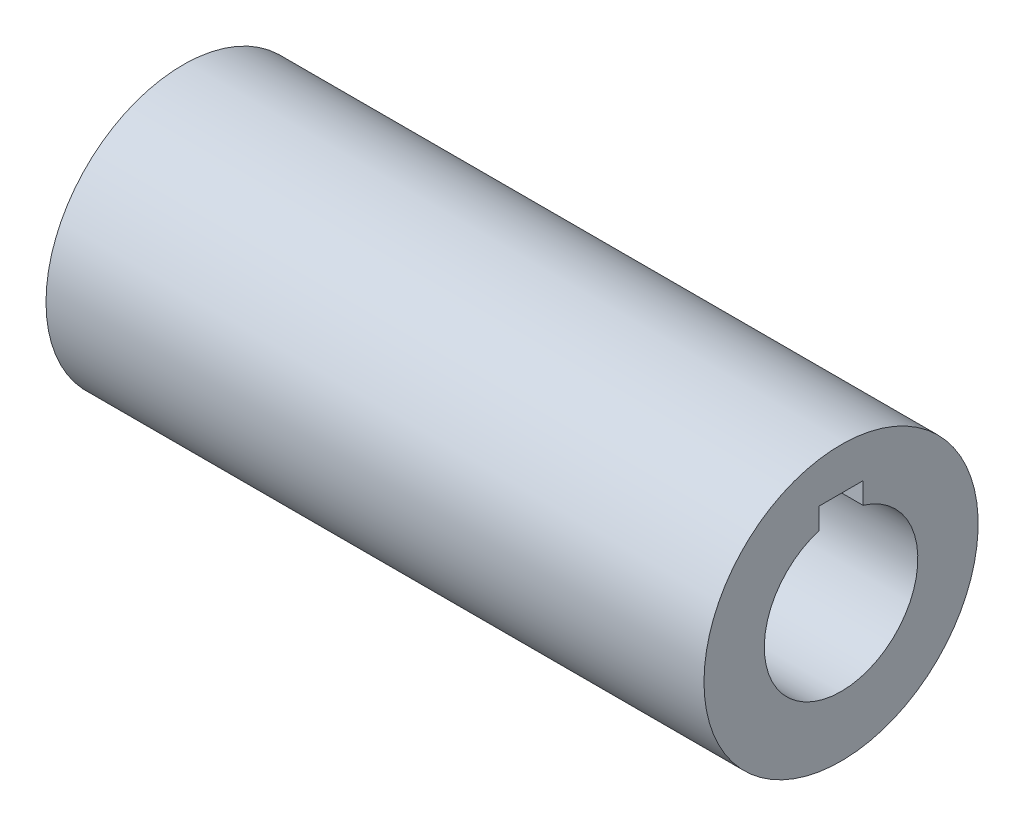
ISO-10303-21;
HEADER;
FILE_DESCRIPTION(('STEP AP214'),'2;1');
FILE_NAME('part.step','',(''),(''),'','','');
FILE_SCHEMA(('AUTOMOTIVE_DESIGN { 1 0 10303 214 1 1 1 1 }'));
ENDSEC;
DATA;
#1=APPLICATION_CONTEXT('core data for automotive mechanical design processes');
#2=APPLICATION_PROTOCOL_DEFINITION('international standard','automotive_design',2000,#1);
#3=PRODUCT_CONTEXT('',#1,'mechanical');
#4=PRODUCT('Part','Part','',(#3));
#5=PRODUCT_RELATED_PRODUCT_CATEGORY('part','',(#4));
#6=PRODUCT_DEFINITION_FORMATION('','',#4);
#7=PRODUCT_DEFINITION_CONTEXT('part definition',#1,'design');
#8=PRODUCT_DEFINITION('design','',#6,#7);
#9=PRODUCT_DEFINITION_SHAPE('','',#8);
#10=(LENGTH_UNIT() NAMED_UNIT(*) SI_UNIT(.MILLI.,.METRE.));
#11=(NAMED_UNIT(*) PLANE_ANGLE_UNIT() SI_UNIT($,.RADIAN.));
#12=(NAMED_UNIT(*) SI_UNIT($,.STERADIAN.) SOLID_ANGLE_UNIT());
#13=UNCERTAINTY_MEASURE_WITH_UNIT(LENGTH_MEASURE(1.E-05),#10,'distance_accuracy_value','');
#14=(GEOMETRIC_REPRESENTATION_CONTEXT(3) GLOBAL_UNCERTAINTY_ASSIGNED_CONTEXT((#13)) GLOBAL_UNIT_ASSIGNED_CONTEXT((#10,
#11,#12)) REPRESENTATION_CONTEXT('',''));
#15=CARTESIAN_POINT('',(0.,0.,0.));
#16=DIRECTION('',(0.,0.,1.));
#17=DIRECTION('',(1.,0.,0.));
#18=AXIS2_PLACEMENT_3D('',#15,#16,#17);
#19=CARTESIAN_POINT('',(59.9999999999996,0.,0.));
#20=DIRECTION('',(-1.,0.,0.));
#21=DIRECTION('',(0.,0.,1.));
#22=AXIS2_PLACEMENT_3D('',#19,#20,#21);
#23=CYLINDRICAL_SURFACE('',#22,21.);
#24=CARTESIAN_POINT('',(-5.87258300203075,0.,0.));
#25=DIRECTION('',(1.,0.,0.));
#26=DIRECTION('',(0.,0.,-1.));
#27=AXIS2_PLACEMENT_3D('',#24,#25,#26);
#28=CIRCLE('',#27,21.);
#29=CARTESIAN_POINT('',(-5.87258300203075,0.,-21.));
#30=VERTEX_POINT('',#29);
#31=EDGE_CURVE('E303',#30,#30,#28,.F.);
#32=ORIENTED_EDGE('',*,*,#31,.T.);
#33=EDGE_LOOP('',(#32));
#34=FACE_BOUND('',#33,.T.);
#35=CARTESIAN_POINT('',(5.87258300203031,0.,-1.11022302462516E-13));
#36=DIRECTION('',(1.,0.,0.));
#37=DIRECTION('',(0.,0.,-1.));
#38=AXIS2_PLACEMENT_3D('',#35,#36,#37);
#39=CIRCLE('',#38,21.);
#40=CARTESIAN_POINT('',(5.87258300203031,0.,-21.0000000000001));
#41=VERTEX_POINT('',#40);
#42=EDGE_CURVE('E309',#41,#41,#39,.T.);
#43=ORIENTED_EDGE('',*,*,#42,.T.);
#44=EDGE_LOOP('',(#43));
#45=FACE_BOUND('',#44,.T.);
#46=ADVANCED_FACE('F25',(#34,#45),#23,.F.);
#47=CARTESIAN_POINT('',(17.186291501015,0.,-5.55111512312578E-13));
#48=DIRECTION('',(-1.,0.,0.));
#49=DIRECTION('',(0.,0.,1.));
#50=AXIS2_PLACEMENT_3D('',#47,#48,#49);
#51=CONICAL_SURFACE('',#50,16.3137084989848,0.785398163397448);
#52=CARTESIAN_POINT('',(17.186291501015,0.,-5.55111512312578E-13));
#53=DIRECTION('',(1.,0.,0.));
#54=DIRECTION('',(0.,0.,-1.));
#55=AXIS2_PLACEMENT_3D('',#52,#53,#54);
#56=CIRCLE('',#55,16.3137084989848);
#57=CARTESIAN_POINT('',(17.1862915010141,15.8157227147496,-3.99999999999989));
#58=VERTEX_POINT('',#57);
#59=CARTESIAN_POINT('',(17.1862915010146,15.8157227147496,3.99999999999978));
#60=VERTEX_POINT('',#59);
#61=EDGE_CURVE('E104',#58,#60,#56,.F.);
#62=ORIENTED_EDGE('',*,*,#61,.T.);
#63=CARTESIAN_POINT('',(19.4999999999994,13.4164078649987,3.99999999999956));
#64=CARTESIAN_POINT('',(19.3078142826328,13.6169510806368,3.99999999999978));
#65=CARTESIAN_POINT('',(19.1154475648358,13.8173207083512,3.99999999999986));
#66=CARTESIAN_POINT('',(18.7303912289096,14.2177486805583,3.99999999999992));
#67=CARTESIAN_POINT('',(18.53770161145,14.4178070256948,3.9999999999999));
#68=CARTESIAN_POINT('',(18.1520378646402,14.8176490683573,3.99999999999989));
#69=CARTESIAN_POINT('',(17.9590637354144,15.0174327660034,3.9999999999999));
#70=CARTESIAN_POINT('',(17.5728608735486,15.4167547345114,3.99999999999989));
#71=CARTESIAN_POINT('',(17.3796321403826,15.6162930048646,3.99999999999986));
#72=CARTESIAN_POINT('',(17.1862915010146,15.8157227147496,3.99999999999978));
#73=B_SPLINE_CURVE_WITH_KNOTS('',3,(#63,#64,#65,#66,#67,#68,#69,#70,#71,#72),.UNSPECIFIED.,.F.,
.F.,(4,2,2,2,4),(0.,0.833292245873165,1.66658276569303,2.49987292076104,3.33316480030809),.UNSPECIFIED.);
#74=CARTESIAN_POINT('',(19.499999999999,13.4164078649987,3.99999999999956));
#75=VERTEX_POINT('',#74);
#76=EDGE_CURVE('E141',#75,#60,#73,.T.);
#77=ORIENTED_EDGE('',*,*,#76,.F.);
#78=CARTESIAN_POINT('',(19.4999999999999,0.,-3.33066907387547E-13));
#79=DIRECTION('',(-1.,0.,0.));
#80=DIRECTION('',(0.,0.,1.));
#81=AXIS2_PLACEMENT_3D('',#78,#79,#80);
#82=CIRCLE('',#81,14.);
#83=CARTESIAN_POINT('',(19.4999999999999,13.4164078649987,-3.99999999999989));
#84=VERTEX_POINT('',#83);
#85=EDGE_CURVE('E110',#75,#84,#82,.F.);
#86=ORIENTED_EDGE('',*,*,#85,.T.);
#87=CARTESIAN_POINT('',(17.1862915010141,15.8157227147496,-3.99999999999989));
#88=CARTESIAN_POINT('',(17.3796321403824,15.6162930048648,-3.99999999999997));
#89=CARTESIAN_POINT('',(17.5728608735486,15.4167547345116,-3.99999999999999));
#90=CARTESIAN_POINT('',(17.9590637354145,15.0174327660036,-4.00000000000001));
#91=CARTESIAN_POINT('',(18.1520378646403,14.8176490683575,-4.));
#92=CARTESIAN_POINT('',(18.5377016114502,14.4178070256949,-4.));
#93=CARTESIAN_POINT('',(18.7303912289098,14.2177486805583,-4.00000000000001));
#94=CARTESIAN_POINT('',(19.1154475648361,13.8173207083512,-3.99999999999999));
#95=CARTESIAN_POINT('',(19.3078142826332,13.6169510806368,-3.99999999999997));
#96=CARTESIAN_POINT('',(19.4999999999999,13.4164078649987,-3.99999999999989));
#97=B_SPLINE_CURVE_WITH_KNOTS('',3,(#87,#88,#89,#90,#91,#92,#93,#94,#95,#96),.UNSPECIFIED.,.F.,
.F.,(4,2,2,2,4),(0.,0.833291879547213,1.66658203461537,2.49987255443539,3.33316480030871),.UNSPECIFIED.);
#98=EDGE_CURVE('E109',#58,#84,#97,.T.);
#99=ORIENTED_EDGE('',*,*,#98,.F.);
#100=EDGE_LOOP('',(#62,#77,#86,#99));
#101=FACE_BOUND('',#100,.T.);
#102=ADVANCED_FACE('F384',(#101),#51,.F.);
#103=CARTESIAN_POINT('',(5.87258300203031,0.,-1.11022302462516E-13));
#104=DIRECTION('',(1.,0.,0.));
#105=DIRECTION('',(0.,0.,-1.));
#106=AXIS2_PLACEMENT_3D('',#103,#104,#105);
#107=DEGENERATE_TOROIDAL_SURFACE('',#106,5.00000000000008,15.9999999999999,.T.);
#108=ORIENTED_EDGE('',*,*,#42,.F.);
#109=EDGE_LOOP('',(#108));
#110=FACE_BOUND('',#109,.T.);
#111=ORIENTED_EDGE('',*,*,#61,.F.);
#112=CARTESIAN_POINT('',(15.5304333292343,17.3,-3.99999999999989));
#113=CARTESIAN_POINT('',(15.6769741943407,17.1861301524212,-3.99999999999996));
#114=CARTESIAN_POINT('',(15.8215033522451,17.0696841973415,-3.99999999999999));
#115=CARTESIAN_POINT('',(16.1062070687332,16.8319333275525,-4.00000000000002));
#116=CARTESIAN_POINT('',(16.2463867593171,16.7106345584603,-4.00000000000001));
#117=CARTESIAN_POINT('',(16.6605654146383,16.339355055098,-3.99999999999999));
#118=CARTESIAN_POINT('',(16.9280690146975,16.082096039612,-3.99999999999998));
#119=CARTESIAN_POINT('',(17.186291501015,15.8157227147496,-4.00000000000011));
#120=B_SPLINE_CURVE_WITH_KNOTS('',3,(#112,#113,#114,#115,#116,#117,#118,#119),.UNSPECIFIED.,.F.,
.F.,(4,2,2,4),(0.,0.556700945962928,1.11271791518685,2.22526343735304),.UNSPECIFIED.);
#121=CARTESIAN_POINT('',(15.5304333292343,17.3,-3.99999999999989));
#122=VERTEX_POINT('',#121);
#123=EDGE_CURVE('E28',#122,#58,#120,.T.);
#124=ORIENTED_EDGE('',*,*,#123,.F.);
#125=CARTESIAN_POINT('',(15.5304333292343,17.3,4.));
#126=CARTESIAN_POINT('',(15.6448979001917,17.3,3.61519214600104));
#127=CARTESIAN_POINT('',(15.7420411123805,17.3,3.22534513436052));
#128=CARTESIAN_POINT('',(15.902099234605,17.3,2.43872424142793));
#129=CARTESIAN_POINT('',(15.965018575724,17.3,2.04195126373355));
#130=CARTESIAN_POINT('',(16.056000630978,17.3,1.25381629012779));
#131=CARTESIAN_POINT('',(16.0848411625999,17.3,0.862543547204068));
#132=CARTESIAN_POINT('',(16.1104975680964,17.3,0.0790738469055436));
#133=CARTESIAN_POINT('',(16.1073182037784,17.3,-0.313122964374562));
#134=CARTESIAN_POINT('',(16.0609719333909,17.3,-1.25762942955736));
#135=CARTESIAN_POINT('',(16.0018590977385,17.3,-1.8092856188997));
#136=CARTESIAN_POINT('',(15.8639562420758,17.3,-2.63290130740055));
#137=CARTESIAN_POINT('',(15.8091127625415,17.3,-2.90908316023045));
#138=CARTESIAN_POINT('',(15.6825096655015,17.3,-3.45765485485042));
#139=CARTESIAN_POINT('',(15.6107432548999,17.3,-3.73004312722227));
#140=CARTESIAN_POINT('',(15.5304333292343,17.3,-3.99999999999989));
#141=B_SPLINE_CURVE_WITH_KNOTS('',3,(#125,#126,#127,#128,#129,#130,#131,#132,#133,#134,#135,
#136,#137,#138,#139,#140),.UNSPECIFIED.,.F.,.F.,(4,2,2,2,2,2,2,4),(0.,1.20385112753442,
2.40754635116669,3.58320240006153,4.75868361500004,6.41880096062013,7.26307342792794,
8.10768537640872),.UNSPECIFIED.);
#142=CARTESIAN_POINT('',(15.5304333292343,17.3,4.));
#143=VERTEX_POINT('',#142);
#144=EDGE_CURVE('E102',#143,#122,#141,.T.);
#145=ORIENTED_EDGE('',*,*,#144,.F.);
#146=CARTESIAN_POINT('',(17.1862915010146,15.8157227147496,3.99999999999978));
#147=CARTESIAN_POINT('',(16.9280690146973,16.0820960396121,3.99999999999992));
#148=CARTESIAN_POINT('',(16.6605654146381,16.3393550550981,3.9999999999999));
#149=CARTESIAN_POINT('',(16.246386759317,16.7106345584604,3.99999999999989));
#150=CARTESIAN_POINT('',(16.1062070687331,16.8319333275525,3.99999999999988));
#151=CARTESIAN_POINT('',(15.8215033522451,17.0696841973415,3.9999999999999));
#152=CARTESIAN_POINT('',(15.6769741943406,17.1861301524212,3.99999999999994));
#153=CARTESIAN_POINT('',(15.5304333292343,17.3,4.));
#154=B_SPLINE_CURVE_WITH_KNOTS('',3,(#146,#147,#148,#149,#150,#151,#152,#153),.UNSPECIFIED.,.F.,
.F.,(4,2,2,4),(0.,1.11254552216604,1.66856249138988,2.22526343735272),.UNSPECIFIED.);
#155=EDGE_CURVE('E287',#60,#143,#154,.T.);
#156=ORIENTED_EDGE('',*,*,#155,.F.);
#157=EDGE_LOOP('',(#111,#124,#145,#156));
#158=FACE_BOUND('',#157,.T.);
#159=ADVANCED_FACE('F99',(#110,#158),#107,.F.);
#160=CARTESIAN_POINT('',(-5.87258300203075,0.,0.));
#161=DIRECTION('',(1.,0.,0.));
#162=DIRECTION('',(0.,0.,-1.));
#163=AXIS2_PLACEMENT_3D('',#160,#161,#162);
#164=DEGENERATE_TOROIDAL_SURFACE('',#163,4.99999999999991,16.0000000000001,.T.);
#165=CARTESIAN_POINT('',(-17.1862915010168,15.8157227147496,-3.99999999999978));
#166=CARTESIAN_POINT('',(-16.928069014699,16.0820960396117,-3.99999999999994));
#167=CARTESIAN_POINT('',(-16.6605654146395,16.3393550550976,-3.99999999999999));
#168=CARTESIAN_POINT('',(-16.2463867593181,16.7106345584597,-4.00000000000001));
#169=CARTESIAN_POINT('',(-16.1062070687342,16.8319333275519,-4.00000000000001));
#170=CARTESIAN_POINT('',(-15.8215033522462,17.0696841973411,-4.));
#171=CARTESIAN_POINT('',(-15.6769741943418,17.186130152421,-4.));
#172=CARTESIAN_POINT('',(-15.5304333292356,17.3,-4.));
#173=B_SPLINE_CURVE_WITH_KNOTS('',3,(#165,#166,#167,#168,#169,#170,#171,#172),.UNSPECIFIED.,.F.,
.F.,(4,2,2,4),(0.,1.11254552216634,1.66856249139036,2.22526343735335),.UNSPECIFIED.);
#174=CARTESIAN_POINT('',(-17.1862915010168,15.8157227147496,-3.99999999999978));
#175=VERTEX_POINT('',#174);
#176=CARTESIAN_POINT('',(-15.5304333292361,17.3,-4.00000000000067));
#177=VERTEX_POINT('',#176);
#178=EDGE_CURVE('E194',#175,#177,#173,.T.);
#179=ORIENTED_EDGE('',*,*,#178,.F.);
#180=CARTESIAN_POINT('',(-17.1862915010164,0.,-4.44089209850063E-13));
#181=DIRECTION('',(1.,0.,0.));
#182=DIRECTION('',(0.,0.,-1.));
#183=AXIS2_PLACEMENT_3D('',#180,#181,#182);
#184=CIRCLE('',#183,16.3137084989848);
#185=CARTESIAN_POINT('',(-17.1862915010155,15.8157227147496,4.));
#186=VERTEX_POINT('',#185);
#187=EDGE_CURVE('E300',#175,#186,#184,.F.);
#188=ORIENTED_EDGE('',*,*,#187,.T.);
#189=CARTESIAN_POINT('',(-15.5304333292419,17.2999999999959,3.99999999999956));
#190=CARTESIAN_POINT('',(-15.6769741943472,17.186130152417,3.99999999999976));
#191=CARTESIAN_POINT('',(-15.8215033522509,17.0696841973374,3.99999999999985));
#192=CARTESIAN_POINT('',(-16.1062070687377,16.8319333275489,3.99999999999993));
#193=CARTESIAN_POINT('',(-16.246386759321,16.7106345584572,3.99999999999992));
#194=CARTESIAN_POINT('',(-16.6605654146408,16.3393550550963,3.99999999999984));
#195=CARTESIAN_POINT('',(-16.9280690146993,16.0820960396114,3.99999999999976));
#196=CARTESIAN_POINT('',(-17.1862915010155,15.8157227147496,4.));
#197=B_SPLINE_CURVE_WITH_KNOTS('',3,(#189,#190,#191,#192,#193,#194,#195,#196),.UNSPECIFIED.,.F.,
.F.,(4,2,2,4),(0.,0.556700945960879,1.11271791518278,2.22526343734497),.UNSPECIFIED.);
#198=CARTESIAN_POINT('',(-15.5304333292396,17.299999999998,3.99999999999845));
#199=VERTEX_POINT('',#198);
#200=EDGE_CURVE('E240',#199,#186,#197,.T.);
#201=ORIENTED_EDGE('',*,*,#200,.F.);
#202=CARTESIAN_POINT('',(-15.5304333292361,17.3,-4.00000000000067));
#203=CARTESIAN_POINT('',(-15.6448979001926,17.3,-3.61519214600153));
#204=CARTESIAN_POINT('',(-15.7420411123811,17.3,-3.22534513436097));
#205=CARTESIAN_POINT('',(-15.9020992346054,17.3,-2.43872424142833));
#206=CARTESIAN_POINT('',(-15.9650185757245,17.3,-2.04195126373396));
#207=CARTESIAN_POINT('',(-16.0560006309786,17.3,-1.25381629012816));
#208=CARTESIAN_POINT('',(-16.0848411626004,17.3,-0.862543547204391));
#209=CARTESIAN_POINT('',(-16.110497568097,17.3,-0.0790738469058026));
#210=CARTESIAN_POINT('',(-16.1073182037792,17.3,0.313122964374323));
#211=CARTESIAN_POINT('',(-16.0609719333919,17.3,1.2576294295568));
#212=CARTESIAN_POINT('',(-16.0018590977393,17.3,1.80928561889879));
#213=CARTESIAN_POINT('',(-15.8639562420765,17.3,2.63290130739909));
#214=CARTESIAN_POINT('',(-15.8091127625422,17.3,2.9090831602288));
#215=CARTESIAN_POINT('',(-15.6825096655027,17.3,3.45765485484845));
#216=CARTESIAN_POINT('',(-15.6107432549014,17.3,3.73004312722019));
#217=CARTESIAN_POINT('',(-15.5304333292365,17.3,3.99999999999778));
#218=B_SPLINE_CURVE_WITH_KNOTS('',3,(#202,#203,#204,#205,#206,#207,#208,#209,#210,#211,#212,
#213,#214,#215,#216,#217),.UNSPECIFIED.,.F.,.F.,(4,2,2,2,2,2,2,4),(0.,1.20385112753432,
2.40754635116664,3.5832024000616,4.75868361500017,6.41880096061924,7.26307342792649,
8.10768537640664),.UNSPECIFIED.);
#219=EDGE_CURVE('E195',#177,#199,#218,.T.);
#220=ORIENTED_EDGE('',*,*,#219,.F.);
#221=EDGE_LOOP('',(#179,#188,#201,#220));
#222=FACE_BOUND('',#221,.T.);
#223=ORIENTED_EDGE('',*,*,#31,.F.);
#224=EDGE_LOOP('',(#223));
#225=FACE_BOUND('',#224,.T.);
#226=ADVANCED_FACE('F170',(#222,#225),#164,.F.);
#227=CARTESIAN_POINT('',(-17.1862915010164,0.,-4.44089209850063E-13));
#228=DIRECTION('',(1.,0.,0.));
#229=DIRECTION('',(0.,0.,-1.));
#230=AXIS2_PLACEMENT_3D('',#227,#228,#229);
#231=CONICAL_SURFACE('',#230,16.3137084989848,0.785398163397452);
#232=CARTESIAN_POINT('',(-17.1862915010155,15.8157227147496,4.));
#233=CARTESIAN_POINT('',(-17.3796321403836,15.6162930048647,3.99999999999994));
#234=CARTESIAN_POINT('',(-17.5728608735498,15.4167547345116,3.9999999999999));
#235=CARTESIAN_POINT('',(-17.9590637354156,15.0174327660035,3.99999999999988));
#236=CARTESIAN_POINT('',(-18.1520378646414,14.8176490683574,3.99999999999989));
#237=CARTESIAN_POINT('',(-18.5377016114513,14.4178070256949,3.9999999999999));
#238=CARTESIAN_POINT('',(-18.7303912289108,14.2177486805584,3.9999999999999));
#239=CARTESIAN_POINT('',(-19.1154475648371,13.8173207083513,3.99999999999988));
#240=CARTESIAN_POINT('',(-19.3078142826341,13.6169510806369,3.99999999999985));
#241=CARTESIAN_POINT('',(-19.5000000000007,13.4164078649988,3.99999999999978));
#242=B_SPLINE_CURVE_WITH_KNOTS('',3,(#232,#233,#234,#235,#236,#237,#238,#239,#240,#241),
.UNSPECIFIED.,.F.,.F.,(4,2,2,2,4),(0.,0.833291879547128,1.6665820346152,2.49987255443513,
3.33316480030837),.UNSPECIFIED.);
#243=CARTESIAN_POINT('',(-19.5000000000007,13.4164078649987,3.99999999999978));
#244=VERTEX_POINT('',#243);
#245=EDGE_CURVE('E175',#186,#244,#242,.T.);
#246=ORIENTED_EDGE('',*,*,#245,.F.);
#247=ORIENTED_EDGE('',*,*,#187,.F.);
#248=CARTESIAN_POINT('',(-19.5000000000007,13.4164078649988,-4.));
#249=CARTESIAN_POINT('',(-19.3078142826342,13.6169510806369,-4.00000000000001));
#250=CARTESIAN_POINT('',(-19.1154475648373,13.8173207083513,-4.00000000000001));
#251=CARTESIAN_POINT('',(-18.7303912289112,14.2177486805583,-4.));
#252=CARTESIAN_POINT('',(-18.5377016114517,14.4178070256948,-4.));
#253=CARTESIAN_POINT('',(-18.1520378646418,14.8176490683571,-4.00000000000001));
#254=CARTESIAN_POINT('',(-17.9590637354161,15.0174327660031,-4.00000000000002));
#255=CARTESIAN_POINT('',(-17.5728608735505,15.4167547345112,-3.99999999999998));
#256=CARTESIAN_POINT('',(-17.3796321403845,15.6162930048644,-3.99999999999992));
#257=CARTESIAN_POINT('',(-17.1862915010168,15.8157227147496,-3.99999999999978));
#258=B_SPLINE_CURVE_WITH_KNOTS('',3,(#248,#249,#250,#251,#252,#253,#254,#255,#256,#257),
.UNSPECIFIED.,.F.,.F.,(4,2,2,2,4),(0.,0.833292245873003,1.66658276569271,2.49987292076055,
3.33316480030744),.UNSPECIFIED.);
#259=CARTESIAN_POINT('',(-19.5000000000007,13.4164078649987,-4.));
#260=VERTEX_POINT('',#259);
#261=EDGE_CURVE('E184',#260,#175,#258,.T.);
#262=ORIENTED_EDGE('',*,*,#261,.F.);
#263=CARTESIAN_POINT('',(-19.5000000000012,0.,-4.44089209850063E-13));
#264=DIRECTION('',(-1.,0.,0.));
#265=DIRECTION('',(0.,0.,1.));
#266=AXIS2_PLACEMENT_3D('',#263,#264,#265);
#267=CIRCLE('',#266,14.);
#268=EDGE_CURVE('E255',#260,#244,#267,.T.);
#269=ORIENTED_EDGE('',*,*,#268,.T.);
#270=EDGE_LOOP('',(#246,#247,#262,#269));
#271=FACE_BOUND('',#270,.T.);
#272=ADVANCED_FACE('F166',(#271),#231,.F.);
#273=CARTESIAN_POINT('',(59.9999999999996,0.,0.));
#274=DIRECTION('',(-1.,0.,0.));
#275=DIRECTION('',(0.,0.,1.));
#276=AXIS2_PLACEMENT_3D('',#273,#274,#275);
#277=CYLINDRICAL_SURFACE('',#276,14.);
#278=DIRECTION('',(-1.,0.,0.));
#279=VECTOR('',#278,1.);
#280=CARTESIAN_POINT('',(120.,13.4164078649987,3.99999999999989));
#281=LINE('',#280,#279);
#282=CARTESIAN_POINT('',(59.9999999999992,13.4164078649987,3.99999999999934));
#283=VERTEX_POINT('',#282);
#284=EDGE_CURVE('E122',#283,#75,#281,.T.);
#285=ORIENTED_EDGE('',*,*,#284,.F.);
#286=CARTESIAN_POINT('',(59.9999999999996,0.,0.));
#287=DIRECTION('',(-1.,0.,0.));
#288=DIRECTION('',(0.,0.,1.));
#289=AXIS2_PLACEMENT_3D('',#286,#287,#288);
#290=CIRCLE('',#289,14.);
#291=CARTESIAN_POINT('',(59.9999999999996,13.4164078649987,-4.00000000000034));
#292=VERTEX_POINT('',#291);
#293=EDGE_CURVE('E324',#283,#292,#290,.F.);
#294=ORIENTED_EDGE('',*,*,#293,.T.);
#295=DIRECTION('',(1.,0.,0.));
#296=VECTOR('',#295,1.);
#297=CARTESIAN_POINT('',(120.,13.4164078649987,-4.));
#298=LINE('',#297,#296);
#299=EDGE_CURVE('E129',#84,#292,#298,.T.);
#300=ORIENTED_EDGE('',*,*,#299,.F.);
#301=ORIENTED_EDGE('',*,*,#85,.F.);
#302=EDGE_LOOP('',(#285,#294,#300,#301));
#303=FACE_BOUND('',#302,.T.);
#304=ADVANCED_FACE('F162',(#303),#277,.F.);
#305=CARTESIAN_POINT('',(120.,3.3,-4.));
#306=DIRECTION('',(0.,0.,1.));
#307=DIRECTION('',(1.,0.,0.));
#308=AXIS2_PLACEMENT_3D('',#305,#306,#307);
#309=PLANE('',#308);
#310=ORIENTED_EDGE('',*,*,#98,.T.);
#311=ORIENTED_EDGE('',*,*,#299,.T.);
#312=DIRECTION('',(0.,1.,0.));
#313=VECTOR('',#312,1.);
#314=CARTESIAN_POINT('',(59.9999999999996,25.,-4.00000000000034));
#315=LINE('',#314,#313);
#316=CARTESIAN_POINT('',(59.9999999999996,17.3,-4.00000000000034));
#317=VERTEX_POINT('',#316);
#318=EDGE_CURVE('E117',#292,#317,#315,.T.);
#319=ORIENTED_EDGE('',*,*,#318,.T.);
#320=DIRECTION('',(1.,0.,0.));
#321=VECTOR('',#320,1.);
#322=CARTESIAN_POINT('',(120.,17.3,-4.));
#323=LINE('',#322,#321);
#324=EDGE_CURVE('E113',#122,#317,#323,.T.);
#325=ORIENTED_EDGE('',*,*,#324,.F.);
#326=ORIENTED_EDGE('',*,*,#123,.T.);
#327=EDGE_LOOP('',(#310,#311,#319,#325,#326));
#328=FACE_BOUND('',#327,.T.);
#329=ADVANCED_FACE('F114',(#328),#309,.T.);
#330=CARTESIAN_POINT('',(120.,17.3,-4.));
#331=DIRECTION('',(0.,-1.,0.));
#332=DIRECTION('',(0.,0.,-1.));
#333=AXIS2_PLACEMENT_3D('',#330,#331,#332);
#334=PLANE('',#333);
#335=ORIENTED_EDGE('',*,*,#144,.T.);
#336=ORIENTED_EDGE('',*,*,#324,.T.);
#337=DIRECTION('',(0.,0.,1.));
#338=VECTOR('',#337,1.);
#339=CARTESIAN_POINT('',(59.9999999999996,17.3,0.));
#340=LINE('',#339,#338);
#341=CARTESIAN_POINT('',(59.9999999999992,17.3,3.99999999999934));
#342=VERTEX_POINT('',#341);
#343=EDGE_CURVE('E293',#317,#342,#340,.T.);
#344=ORIENTED_EDGE('',*,*,#343,.T.);
#345=DIRECTION('',(-1.,0.,0.));
#346=VECTOR('',#345,1.);
#347=CARTESIAN_POINT('',(120.,17.3,3.99999999999989));
#348=LINE('',#347,#346);
#349=EDGE_CURVE('E126',#143,#342,#348,.F.);
#350=ORIENTED_EDGE('',*,*,#349,.F.);
#351=EDGE_LOOP('',(#335,#336,#344,#350));
#352=FACE_BOUND('',#351,.T.);
#353=ADVANCED_FACE('F124',(#352),#334,.T.);
#354=CARTESIAN_POINT('',(120.,17.3,3.99999999999989));
#355=DIRECTION('',(0.,0.,-1.));
#356=DIRECTION('',(-1.,0.,0.));
#357=AXIS2_PLACEMENT_3D('',#354,#355,#356);
#358=PLANE('',#357);
#359=ORIENTED_EDGE('',*,*,#155,.T.);
#360=ORIENTED_EDGE('',*,*,#349,.T.);
#361=DIRECTION('',(0.,1.,0.));
#362=VECTOR('',#361,1.);
#363=CARTESIAN_POINT('',(59.9999999999992,25.,3.99999999999934));
#364=LINE('',#363,#362);
#365=EDGE_CURVE('E273',#342,#283,#364,.F.);
#366=ORIENTED_EDGE('',*,*,#365,.T.);
#367=ORIENTED_EDGE('',*,*,#284,.T.);
#368=ORIENTED_EDGE('',*,*,#76,.T.);
#369=EDGE_LOOP('',(#359,#360,#366,#367,#368));
#370=FACE_BOUND('',#369,.T.);
#371=ADVANCED_FACE('F156',(#370),#358,.T.);
#372=CARTESIAN_POINT('',(120.,17.3,-4.));
#373=DIRECTION('',(0.,-1.,0.));
#374=DIRECTION('',(0.,0.,-1.));
#375=AXIS2_PLACEMENT_3D('',#372,#373,#374);
#376=PLANE('',#375);
#377=ORIENTED_EDGE('',*,*,#219,.T.);
#378=DIRECTION('',(-1.,0.,0.));
#379=VECTOR('',#378,1.);
#380=CARTESIAN_POINT('',(120.,17.3,3.99999999999989));
#381=LINE('',#380,#379);
#382=CARTESIAN_POINT('',(-60.0000000000014,17.3,4.));
#383=VERTEX_POINT('',#382);
#384=EDGE_CURVE('E247',#383,#199,#381,.F.);
#385=ORIENTED_EDGE('',*,*,#384,.F.);
#386=DIRECTION('',(0.,0.,-1.));
#387=VECTOR('',#386,1.);
#388=CARTESIAN_POINT('',(-60.0000000000014,17.3,-4.44089209850063E-13));
#389=LINE('',#388,#387);
#390=CARTESIAN_POINT('',(-60.0000000000005,17.3,-4.00000000000045));
#391=VERTEX_POINT('',#390);
#392=EDGE_CURVE('E268',#383,#391,#389,.T.);
#393=ORIENTED_EDGE('',*,*,#392,.T.);
#394=DIRECTION('',(1.,0.,0.));
#395=VECTOR('',#394,1.);
#396=CARTESIAN_POINT('',(120.,17.3,-4.));
#397=LINE('',#396,#395);
#398=EDGE_CURVE('E279',#177,#391,#397,.F.);
#399=ORIENTED_EDGE('',*,*,#398,.F.);
#400=EDGE_LOOP('',(#377,#385,#393,#399));
#401=FACE_BOUND('',#400,.T.);
#402=ADVANCED_FACE('F209',(#401),#376,.T.);
#403=CARTESIAN_POINT('',(120.,3.3,-4.));
#404=DIRECTION('',(0.,0.,1.));
#405=DIRECTION('',(1.,0.,0.));
#406=AXIS2_PLACEMENT_3D('',#403,#404,#405);
#407=PLANE('',#406);
#408=ORIENTED_EDGE('',*,*,#178,.T.);
#409=ORIENTED_EDGE('',*,*,#398,.T.);
#410=DIRECTION('',(0.,1.,0.));
#411=VECTOR('',#410,1.);
#412=CARTESIAN_POINT('',(-60.0000000000005,0.,-4.00000000000045));
#413=LINE('',#412,#411);
#414=CARTESIAN_POINT('',(-60.0000000000005,13.4164078649987,-4.00000000000045));
#415=VERTEX_POINT('',#414);
#416=EDGE_CURVE('E272',#391,#415,#413,.F.);
#417=ORIENTED_EDGE('',*,*,#416,.T.);
#418=DIRECTION('',(-1.,0.,0.));
#419=VECTOR('',#418,1.);
#420=CARTESIAN_POINT('',(59.9999999999996,13.4164078649987,-4.00000000000034));
#421=LINE('',#420,#419);
#422=EDGE_CURVE('E261',#415,#260,#421,.F.);
#423=ORIENTED_EDGE('',*,*,#422,.T.);
#424=ORIENTED_EDGE('',*,*,#261,.T.);
#425=EDGE_LOOP('',(#408,#409,#417,#423,#424));
#426=FACE_BOUND('',#425,.T.);
#427=ADVANCED_FACE('F204',(#426),#407,.T.);
#428=CARTESIAN_POINT('',(59.9999999999996,0.,0.));
#429=DIRECTION('',(-1.,0.,0.));
#430=DIRECTION('',(0.,0.,1.));
#431=AXIS2_PLACEMENT_3D('',#428,#429,#430);
#432=CYLINDRICAL_SURFACE('',#431,14.);
#433=DIRECTION('',(-1.,0.,0.));
#434=VECTOR('',#433,1.);
#435=CARTESIAN_POINT('',(120.,13.4164078649987,3.99999999999989));
#436=LINE('',#435,#434);
#437=CARTESIAN_POINT('',(-60.0000000000014,13.4164078649987,4.));
#438=VERTEX_POINT('',#437);
#439=EDGE_CURVE('E254',#244,#438,#436,.T.);
#440=ORIENTED_EDGE('',*,*,#439,.F.);
#441=ORIENTED_EDGE('',*,*,#268,.F.);
#442=ORIENTED_EDGE('',*,*,#422,.F.);
#443=CARTESIAN_POINT('',(-60.0000000000014,0.,-4.44089209850063E-13));
#444=DIRECTION('',(-1.,0.,0.));
#445=DIRECTION('',(0.,0.,1.));
#446=AXIS2_PLACEMENT_3D('',#443,#444,#445);
#447=CIRCLE('',#446,14.);
#448=EDGE_CURVE('E50',#415,#438,#447,.T.);
#449=ORIENTED_EDGE('',*,*,#448,.T.);
#450=EDGE_LOOP('',(#440,#441,#442,#449));
#451=FACE_BOUND('',#450,.T.);
#452=ADVANCED_FACE('F208',(#451),#432,.F.);
#453=CARTESIAN_POINT('',(120.,17.3,3.99999999999989));
#454=DIRECTION('',(0.,0.,-1.));
#455=DIRECTION('',(-1.,0.,0.));
#456=AXIS2_PLACEMENT_3D('',#453,#454,#455);
#457=PLANE('',#456);
#458=ORIENTED_EDGE('',*,*,#245,.T.);
#459=ORIENTED_EDGE('',*,*,#439,.T.);
#460=DIRECTION('',(0.,1.,0.));
#461=VECTOR('',#460,1.);
#462=CARTESIAN_POINT('',(-60.0000000000014,0.,4.));
#463=LINE('',#462,#461);
#464=EDGE_CURVE('E322',#438,#383,#463,.T.);
#465=ORIENTED_EDGE('',*,*,#464,.T.);
#466=ORIENTED_EDGE('',*,*,#384,.T.);
#467=ORIENTED_EDGE('',*,*,#200,.T.);
#468=EDGE_LOOP('',(#458,#459,#465,#466,#467));
#469=FACE_BOUND('',#468,.T.);
#470=ADVANCED_FACE('F234',(#469),#457,.T.);
#471=CARTESIAN_POINT('',(59.9999999999996,25.,0.));
#472=DIRECTION('',(-1.,0.,0.));
#473=DIRECTION('',(0.,0.,1.));
#474=AXIS2_PLACEMENT_3D('',#471,#472,#473);
#475=PLANE('',#474);
#476=ORIENTED_EDGE('',*,*,#343,.F.);
#477=ORIENTED_EDGE('',*,*,#318,.F.);
#478=ORIENTED_EDGE('',*,*,#293,.F.);
#479=ORIENTED_EDGE('',*,*,#365,.F.);
#480=EDGE_LOOP('',(#476,#477,#478,#479));
#481=FACE_BOUND('',#480,.T.);
#482=CARTESIAN_POINT('',(59.9999999999996,0.,0.));
#483=DIRECTION('',(-1.,0.,0.));
#484=DIRECTION('',(0.,0.,1.));
#485=AXIS2_PLACEMENT_3D('',#482,#483,#484);
#486=CIRCLE('',#485,25.);
#487=CARTESIAN_POINT('',(59.9999999999996,0.,25.));
#488=VERTEX_POINT('',#487);
#489=EDGE_CURVE('E41',#488,#488,#486,.T.);
#490=ORIENTED_EDGE('',*,*,#489,.F.);
#491=EDGE_LOOP('',(#490));
#492=FACE_BOUND('',#491,.T.);
#493=ADVANCED_FACE('F228',(#481,#492),#475,.F.);
#494=CARTESIAN_POINT('',(-60.0000000000014,0.,-4.44089209850063E-13));
#495=DIRECTION('',(1.,0.,0.));
#496=DIRECTION('',(0.,0.,-1.));
#497=AXIS2_PLACEMENT_3D('',#494,#495,#496);
#498=PLANE('',#497);
#499=ORIENTED_EDGE('',*,*,#448,.F.);
#500=ORIENTED_EDGE('',*,*,#416,.F.);
#501=ORIENTED_EDGE('',*,*,#392,.F.);
#502=ORIENTED_EDGE('',*,*,#464,.F.);
#503=EDGE_LOOP('',(#499,#500,#501,#502));
#504=FACE_BOUND('',#503,.T.);
#505=CARTESIAN_POINT('',(-60.0000000000014,0.,-4.44089209850063E-13));
#506=DIRECTION('',(-1.,0.,0.));
#507=DIRECTION('',(0.,0.,1.));
#508=AXIS2_PLACEMENT_3D('',#505,#506,#507);
#509=CIRCLE('',#508,25.);
#510=CARTESIAN_POINT('',(-60.0000000000014,0.,24.9999999999996));
#511=VERTEX_POINT('',#510);
#512=EDGE_CURVE('E13',#511,#511,#509,.F.);
#513=ORIENTED_EDGE('',*,*,#512,.F.);
#514=EDGE_LOOP('',(#513));
#515=FACE_BOUND('',#514,.T.);
#516=ADVANCED_FACE('F222',(#504,#515),#498,.F.);
#517=CARTESIAN_POINT('',(59.9999999999996,0.,0.));
#518=DIRECTION('',(-1.,0.,0.));
#519=DIRECTION('',(0.,0.,1.));
#520=AXIS2_PLACEMENT_3D('',#517,#518,#519);
#521=CYLINDRICAL_SURFACE('',#520,25.);
#522=ORIENTED_EDGE('',*,*,#512,.T.);
#523=EDGE_LOOP('',(#522));
#524=FACE_BOUND('',#523,.T.);
#525=ORIENTED_EDGE('',*,*,#489,.T.);
#526=EDGE_LOOP('',(#525));
#527=FACE_BOUND('',#526,.T.);
#528=ADVANCED_FACE('F220',(#524,#527),#521,.T.);
#529=CLOSED_SHELL('',(#46,#102,#159,#226,#272,#304,#329,#353,#371,#402,#427,#452,#470,#493,#516,#528));
#530=MANIFOLD_SOLID_BREP('B1',#529);
#531=ADVANCED_BREP_SHAPE_REPRESENTATION('',(#18,#530),#14);
#532=SHAPE_DEFINITION_REPRESENTATION(#9,#531);
ENDSEC;
END-ISO-10303-21;
